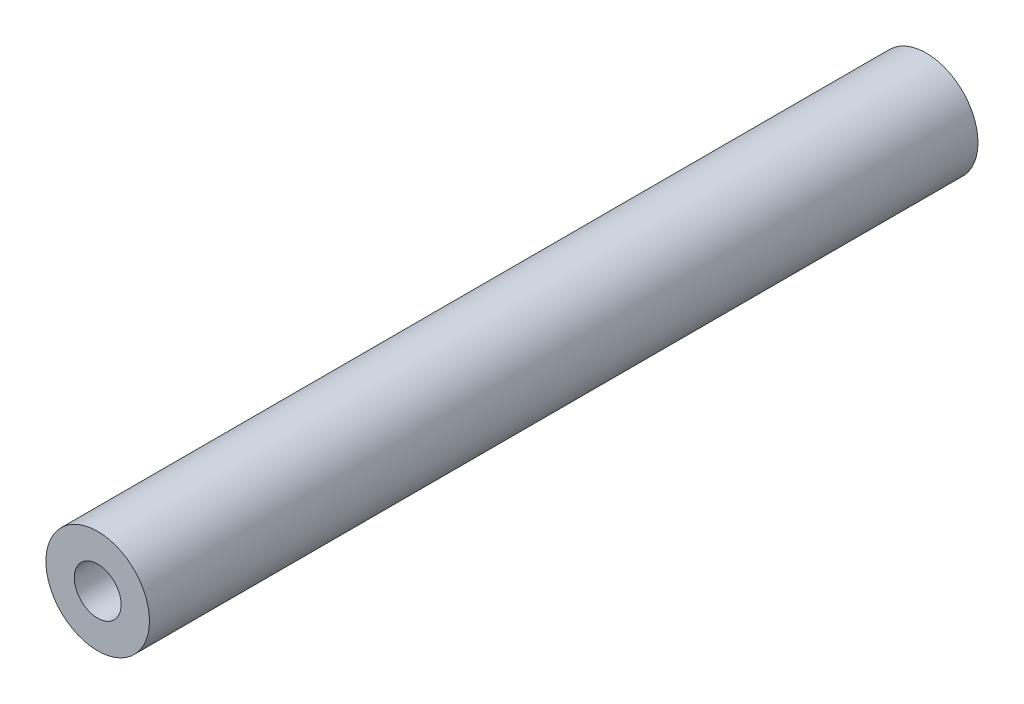
ISO-10303-21;
HEADER;
FILE_DESCRIPTION(('STEP AP214'),'2;1');
FILE_NAME('part.step','',(''),(''),'','','');
FILE_SCHEMA(('AUTOMOTIVE_DESIGN { 1 0 10303 214 1 1 1 1 }'));
ENDSEC;
DATA;
#1=APPLICATION_CONTEXT('core data for automotive mechanical design processes');
#2=APPLICATION_PROTOCOL_DEFINITION('international standard','automotive_design',2000,#1);
#3=PRODUCT_CONTEXT('',#1,'mechanical');
#4=PRODUCT('Part','Part','',(#3));
#5=PRODUCT_RELATED_PRODUCT_CATEGORY('part','',(#4));
#6=PRODUCT_DEFINITION_FORMATION('','',#4);
#7=PRODUCT_DEFINITION_CONTEXT('part definition',#1,'design');
#8=PRODUCT_DEFINITION('design','',#6,#7);
#9=PRODUCT_DEFINITION_SHAPE('','',#8);
#10=(LENGTH_UNIT() NAMED_UNIT(*) SI_UNIT(.MILLI.,.METRE.));
#11=(NAMED_UNIT(*) PLANE_ANGLE_UNIT() SI_UNIT($,.RADIAN.));
#12=(NAMED_UNIT(*) SI_UNIT($,.STERADIAN.) SOLID_ANGLE_UNIT());
#13=UNCERTAINTY_MEASURE_WITH_UNIT(LENGTH_MEASURE(1.E-05),#10,'distance_accuracy_value','');
#14=(GEOMETRIC_REPRESENTATION_CONTEXT(3) GLOBAL_UNCERTAINTY_ASSIGNED_CONTEXT((#13)) GLOBAL_UNIT_ASSIGNED_CONTEXT((#10,
#11,#12)) REPRESENTATION_CONTEXT('',''));
#15=CARTESIAN_POINT('',(0.,0.,0.));
#16=DIRECTION('',(0.,0.,1.));
#17=DIRECTION('',(1.,0.,0.));
#18=AXIS2_PLACEMENT_3D('',#15,#16,#17);
#19=CARTESIAN_POINT('',(0.,0.,101.6));
#20=DIRECTION('',(0.,0.,-1.));
#21=DIRECTION('',(-1.,0.,0.));
#22=AXIS2_PLACEMENT_3D('',#19,#20,#21);
#23=CYLINDRICAL_SURFACE('',#22,12.7);
#24=CARTESIAN_POINT('',(0.,0.,101.6));
#25=DIRECTION('',(0.,0.,1.));
#26=DIRECTION('',(1.,0.,0.));
#27=AXIS2_PLACEMENT_3D('',#24,#25,#26);
#28=CIRCLE('',#27,12.7);
#29=CARTESIAN_POINT('',(12.7,0.,101.6));
#30=VERTEX_POINT('',#29);
#31=EDGE_CURVE('E11',#30,#30,#28,.T.);
#32=ORIENTED_EDGE('',*,*,#31,.F.);
#33=EDGE_LOOP('',(#32));
#34=FACE_BOUND('',#33,.T.);
#35=CARTESIAN_POINT('',(0.,0.,-101.6));
#36=DIRECTION('',(0.,0.,1.));
#37=DIRECTION('',(1.,0.,0.));
#38=AXIS2_PLACEMENT_3D('',#35,#36,#37);
#39=CIRCLE('',#38,12.7);
#40=CARTESIAN_POINT('',(12.7,0.,-101.6));
#41=VERTEX_POINT('',#40);
#42=EDGE_CURVE('E44',#41,#41,#39,.T.);
#43=ORIENTED_EDGE('',*,*,#42,.T.);
#44=EDGE_LOOP('',(#43));
#45=FACE_BOUND('',#44,.T.);
#46=ADVANCED_FACE('F41',(#34,#45),#23,.T.);
#47=CARTESIAN_POINT('',(0.,0.,101.6));
#48=DIRECTION('',(0.,0.,1.));
#49=DIRECTION('',(1.,0.,0.));
#50=AXIS2_PLACEMENT_3D('',#47,#48,#49);
#51=PLANE('',#50);
#52=CARTESIAN_POINT('',(0.,0.,101.6));
#53=DIRECTION('',(0.,0.,1.));
#54=DIRECTION('',(1.,0.,0.));
#55=AXIS2_PLACEMENT_3D('',#52,#53,#54);
#56=CIRCLE('',#55,5.75437);
#57=CARTESIAN_POINT('',(5.75437,0.,101.6));
#58=VERTEX_POINT('',#57);
#59=EDGE_CURVE('E64',#58,#58,#56,.T.);
#60=ORIENTED_EDGE('',*,*,#59,.F.);
#61=EDGE_LOOP('',(#60));
#62=FACE_BOUND('',#61,.T.);
#63=ORIENTED_EDGE('',*,*,#31,.T.);
#64=EDGE_LOOP('',(#63));
#65=FACE_BOUND('',#64,.T.);
#66=ADVANCED_FACE('F83',(#62,#65),#51,.T.);
#67=CARTESIAN_POINT('',(0.,0.,-101.6));
#68=DIRECTION('',(0.,0.,1.));
#69=DIRECTION('',(1.,0.,0.));
#70=AXIS2_PLACEMENT_3D('',#67,#68,#69);
#71=PLANE('',#70);
#72=CARTESIAN_POINT('',(0.,0.,-101.6));
#73=DIRECTION('',(0.,0.,-1.));
#74=DIRECTION('',(-1.,0.,0.));
#75=AXIS2_PLACEMENT_3D('',#72,#73,#74);
#76=CIRCLE('',#75,3.26389999999999);
#77=CARTESIAN_POINT('',(-3.26389999999999,0.,-101.6));
#78=VERTEX_POINT('',#77);
#79=EDGE_CURVE('E65',#78,#78,#76,.T.);
#80=ORIENTED_EDGE('',*,*,#79,.F.);
#81=EDGE_LOOP('',(#80));
#82=FACE_BOUND('',#81,.T.);
#83=ORIENTED_EDGE('',*,*,#42,.F.);
#84=EDGE_LOOP('',(#83));
#85=FACE_BOUND('',#84,.T.);
#86=ADVANCED_FACE('F80',(#82,#85),#71,.F.);
#87=CARTESIAN_POINT('',(0.,0.,69.85));
#88=DIRECTION('',(0.,0.,1.));
#89=DIRECTION('',(1.,0.,0.));
#90=AXIS2_PLACEMENT_3D('',#87,#88,#89);
#91=CONICAL_SURFACE('',#90,5.75436999999999,1.02974425867665);
#92=CARTESIAN_POINT('',(0.,0.,66.3924256796864));
#93=VERTEX_POINT('',#92);
#94=VERTEX_LOOP('',#93);
#95=FACE_BOUND('',#94,.T.);
#96=CARTESIAN_POINT('',(0.,0.,69.85));
#97=DIRECTION('',(0.,0.,1.));
#98=DIRECTION('',(1.,0.,0.));
#99=AXIS2_PLACEMENT_3D('',#96,#97,#98);
#100=CIRCLE('',#99,5.75436999999999);
#101=CARTESIAN_POINT('',(5.75436999999999,0.,69.85));
#102=VERTEX_POINT('',#101);
#103=EDGE_CURVE('E68',#102,#102,#100,.T.);
#104=ORIENTED_EDGE('',*,*,#103,.T.);
#105=EDGE_LOOP('',(#104));
#106=FACE_BOUND('',#105,.T.);
#107=ADVANCED_FACE('F82',(#95,#106),#91,.F.);
#108=CARTESIAN_POINT('',(0.,0.,101.6));
#109=DIRECTION('',(0.,0.,1.));
#110=DIRECTION('',(1.,0.,0.));
#111=AXIS2_PLACEMENT_3D('',#108,#109,#110);
#112=CYLINDRICAL_SURFACE('',#111,5.75437);
#113=ORIENTED_EDGE('',*,*,#103,.F.);
#114=EDGE_LOOP('',(#113));
#115=FACE_BOUND('',#114,.T.);
#116=ORIENTED_EDGE('',*,*,#59,.T.);
#117=EDGE_LOOP('',(#116));
#118=FACE_BOUND('',#117,.T.);
#119=ADVANCED_FACE('F58',(#115,#118),#112,.F.);
#120=CARTESIAN_POINT('',(0.,0.,-81.8515));
#121=DIRECTION('',(0.,0.,-1.));
#122=DIRECTION('',(-1.,0.,0.));
#123=AXIS2_PLACEMENT_3D('',#120,#121,#122);
#124=CONICAL_SURFACE('',#123,3.26389999999999,1.02974425867665);
#125=CARTESIAN_POINT('',(0.,0.,-79.8903510255559));
#126=VERTEX_POINT('',#125);
#127=VERTEX_LOOP('',#126);
#128=FACE_BOUND('',#127,.T.);
#129=CARTESIAN_POINT('',(0.,0.,-81.8515));
#130=DIRECTION('',(0.,0.,-1.));
#131=DIRECTION('',(-1.,0.,0.));
#132=AXIS2_PLACEMENT_3D('',#129,#130,#131);
#133=CIRCLE('',#132,3.26389999999999);
#134=CARTESIAN_POINT('',(-3.26389999999999,0.,-81.8515));
#135=VERTEX_POINT('',#134);
#136=EDGE_CURVE('E62',#135,#135,#133,.T.);
#137=ORIENTED_EDGE('',*,*,#136,.T.);
#138=EDGE_LOOP('',(#137));
#139=FACE_BOUND('',#138,.T.);
#140=ADVANCED_FACE('F54',(#128,#139),#124,.F.);
#141=CARTESIAN_POINT('',(0.,0.,-101.6));
#142=DIRECTION('',(0.,0.,-1.));
#143=DIRECTION('',(-1.,0.,0.));
#144=AXIS2_PLACEMENT_3D('',#141,#142,#143);
#145=CYLINDRICAL_SURFACE('',#144,3.26389999999999);
#146=ORIENTED_EDGE('',*,*,#136,.F.);
#147=EDGE_LOOP('',(#146));
#148=FACE_BOUND('',#147,.T.);
#149=ORIENTED_EDGE('',*,*,#79,.T.);
#150=EDGE_LOOP('',(#149));
#151=FACE_BOUND('',#150,.T.);
#152=ADVANCED_FACE('F57',(#148,#151),#145,.F.);
#153=CLOSED_SHELL('',(#46,#66,#86,#107,#119,#140,#152));
#154=MANIFOLD_SOLID_BREP('B2',#153);
#155=ADVANCED_BREP_SHAPE_REPRESENTATION('',(#18,#154),#14);
#156=SHAPE_DEFINITION_REPRESENTATION(#9,#155);
ENDSEC;
END-ISO-10303-21;
